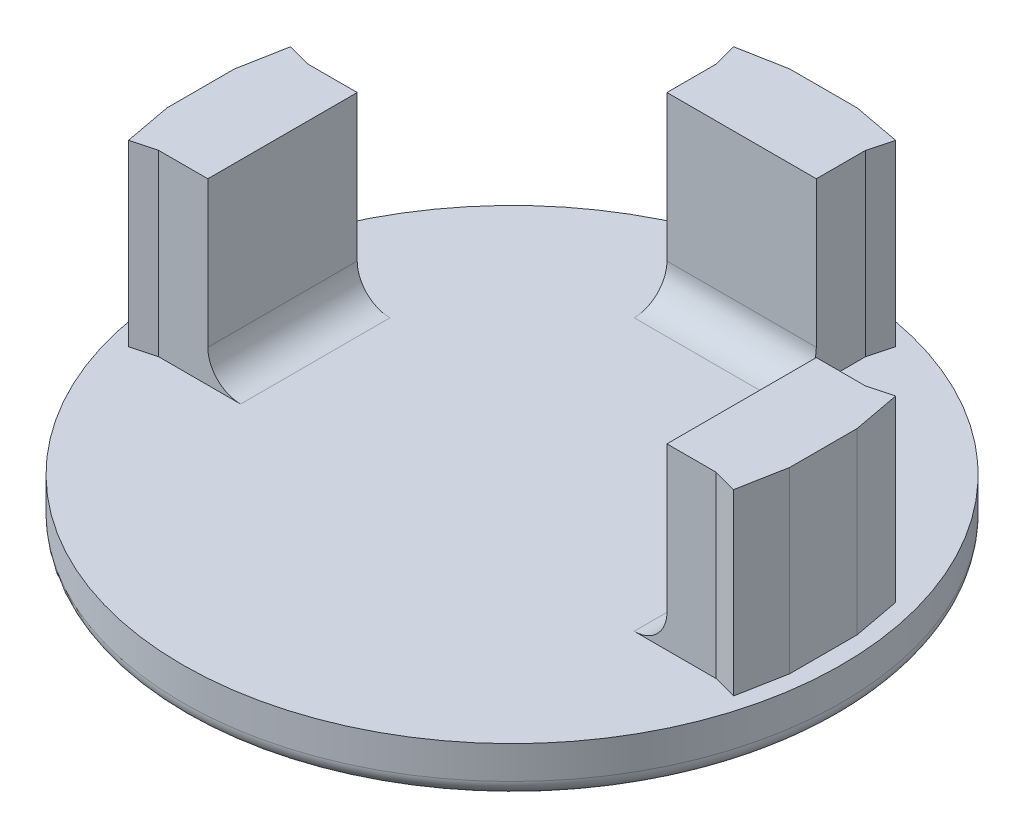
ISO-10303-21;
HEADER;
FILE_DESCRIPTION(('STEP AP214'),'2;1');
FILE_NAME('part.step','',(''),(''),'','','');
FILE_SCHEMA(('AUTOMOTIVE_DESIGN { 1 0 10303 214 1 1 1 1 }'));
ENDSEC;
DATA;
#1=APPLICATION_CONTEXT('core data for automotive mechanical design processes');
#2=APPLICATION_PROTOCOL_DEFINITION('international standard','automotive_design',2000,#1);
#3=PRODUCT_CONTEXT('',#1,'mechanical');
#4=PRODUCT('Part','Part','',(#3));
#5=PRODUCT_RELATED_PRODUCT_CATEGORY('part','',(#4));
#6=PRODUCT_DEFINITION_FORMATION('','',#4);
#7=PRODUCT_DEFINITION_CONTEXT('part definition',#1,'design');
#8=PRODUCT_DEFINITION('design','',#6,#7);
#9=PRODUCT_DEFINITION_SHAPE('','',#8);
#10=(LENGTH_UNIT() NAMED_UNIT(*) SI_UNIT(.MILLI.,.METRE.));
#11=(NAMED_UNIT(*) PLANE_ANGLE_UNIT() SI_UNIT($,.RADIAN.));
#12=(NAMED_UNIT(*) SI_UNIT($,.STERADIAN.) SOLID_ANGLE_UNIT());
#13=UNCERTAINTY_MEASURE_WITH_UNIT(LENGTH_MEASURE(1.E-05),#10,'distance_accuracy_value','');
#14=(GEOMETRIC_REPRESENTATION_CONTEXT(3) GLOBAL_UNCERTAINTY_ASSIGNED_CONTEXT((#13)) GLOBAL_UNIT_ASSIGNED_CONTEXT((#10,
#11,#12)) REPRESENTATION_CONTEXT('',''));
#15=CARTESIAN_POINT('',(0.,0.,0.));
#16=DIRECTION('',(0.,0.,1.));
#17=DIRECTION('',(1.,0.,0.));
#18=AXIS2_PLACEMENT_3D('',#15,#16,#17);
#19=CARTESIAN_POINT('',(0.,3.,0.));
#20=DIRECTION('',(0.,1.,0.));
#21=DIRECTION('',(0.,0.,1.));
#22=AXIS2_PLACEMENT_3D('',#19,#20,#21);
#23=PLANE('',#22);
#24=DIRECTION('',(-1.,0.,0.));
#25=VECTOR('',#24,1.);
#26=CARTESIAN_POINT('',(-14.0002945426876,3.,-4.55521519380437));
#27=LINE('',#26,#25);
#28=CARTESIAN_POINT('',(-12.0002945426876,3.,-4.55521519380437));
#29=VERTEX_POINT('',#28);
#30=CARTESIAN_POINT('',(-17.0002945426876,3.,-4.55521519380437));
#31=VERTEX_POINT('',#30);
#32=EDGE_CURVE('E302',#29,#31,#27,.T.);
#33=ORIENTED_EDGE('',*,*,#32,.F.);
#34=DIRECTION('',(0.,0.,-1.));
#35=VECTOR('',#34,1.);
#36=CARTESIAN_POINT('',(-12.0002945426876,3.,0.));
#37=LINE('',#36,#35);
#38=CARTESIAN_POINT('',(-12.0002945426876,3.,4.55521519380438));
#39=VERTEX_POINT('',#38);
#40=EDGE_CURVE('E398',#29,#39,#37,.F.);
#41=ORIENTED_EDGE('',*,*,#40,.T.);
#42=DIRECTION('',(1.,0.,0.));
#43=VECTOR('',#42,1.);
#44=CARTESIAN_POINT('',(-17.0002945426876,3.,4.55521519380438));
#45=LINE('',#44,#43);
#46=CARTESIAN_POINT('',(-17.0002945426876,3.,4.55521519380438));
#47=VERTEX_POINT('',#46);
#48=EDGE_CURVE('E299',#47,#39,#45,.T.);
#49=ORIENTED_EDGE('',*,*,#48,.F.);
#50=DIRECTION('',(0.965925826289068,0.,-0.258819045102521));
#51=VECTOR('',#50,1.);
#52=CARTESIAN_POINT('',(-18.4491832821212,3.,4.94344376145816));
#53=LINE('',#52,#51);
#54=CARTESIAN_POINT('',(-18.4491832821212,3.,4.94344376145816));
#55=VERTEX_POINT('',#54);
#56=EDGE_CURVE('E296',#55,#47,#53,.T.);
#57=ORIENTED_EDGE('',*,*,#56,.F.);
#58=DIRECTION('',(-0.183736516204825,0.,-0.982975530017362));
#59=VECTOR('',#58,1.);
#60=CARTESIAN_POINT('',(-18.4491832821212,3.,4.94344376145816));
#61=LINE('',#60,#59);
#62=CARTESIAN_POINT('',(-18.9891832821212,3.,2.05448735163028));
#63=VERTEX_POINT('',#62);
#64=EDGE_CURVE('E311',#55,#63,#61,.T.);
#65=ORIENTED_EDGE('',*,*,#64,.T.);
#66=DIRECTION('',(0.,0.,-1.));
#67=VECTOR('',#66,1.);
#68=CARTESIAN_POINT('',(-18.9891832821212,3.,2.05448735163028));
#69=LINE('',#68,#67);
#70=CARTESIAN_POINT('',(-18.9891832821212,3.,-2.05448735163028));
#71=VERTEX_POINT('',#70);
#72=EDGE_CURVE('E309',#63,#71,#69,.T.);
#73=ORIENTED_EDGE('',*,*,#72,.T.);
#74=DIRECTION('',(0.183736516204825,0.,-0.982975530017362));
#75=VECTOR('',#74,1.);
#76=CARTESIAN_POINT('',(-18.9891832821212,3.,-2.05448735163028));
#77=LINE('',#76,#75);
#78=CARTESIAN_POINT('',(-18.4491832821212,3.,-4.94344376145817));
#79=VERTEX_POINT('',#78);
#80=EDGE_CURVE('E307',#71,#79,#77,.T.);
#81=ORIENTED_EDGE('',*,*,#80,.T.);
#82=DIRECTION('',(0.965925826289065,0.,0.258819045102531));
#83=VECTOR('',#82,1.);
#84=CARTESIAN_POINT('',(-18.4491832821212,3.,-4.94344376145817));
#85=LINE('',#84,#83);
#86=EDGE_CURVE('E305',#79,#31,#85,.T.);
#87=ORIENTED_EDGE('',*,*,#86,.T.);
#88=EDGE_LOOP('',(#33,#41,#49,#57,#65,#73,#81,#87));
#89=FACE_BOUND('',#88,.T.);
#90=CARTESIAN_POINT('',(0.,3.,0.));
#91=DIRECTION('',(0.,1.,0.));
#92=DIRECTION('',(0.,0.,1.));
#93=AXIS2_PLACEMENT_3D('',#90,#91,#92);
#94=CIRCLE('',#93,20.1);
#95=CARTESIAN_POINT('',(0.,3.,20.1));
#96=VERTEX_POINT('',#95);
#97=EDGE_CURVE('E392',#96,#96,#94,.T.);
#98=ORIENTED_EDGE('',*,*,#97,.T.);
#99=EDGE_LOOP('',(#98));
#100=FACE_BOUND('',#99,.T.);
#101=DIRECTION('',(0.,0.,-1.));
#102=VECTOR('',#101,1.);
#103=CARTESIAN_POINT('',(4.55521519380437,3.,-14.0002945426876));
#104=LINE('',#103,#102);
#105=CARTESIAN_POINT('',(4.55521519380437,3.,-12.0002945426876));
#106=VERTEX_POINT('',#105);
#107=CARTESIAN_POINT('',(4.55521519380437,3.,-17.0002945426876));
#108=VERTEX_POINT('',#107);
#109=EDGE_CURVE('E359',#106,#108,#104,.T.);
#110=ORIENTED_EDGE('',*,*,#109,.F.);
#111=DIRECTION('',(1.,0.,0.));
#112=VECTOR('',#111,1.);
#113=CARTESIAN_POINT('',(0.,3.,-12.0002945426876));
#114=LINE('',#113,#112);
#115=CARTESIAN_POINT('',(-4.55521519380438,3.,-12.0002945426876));
#116=VERTEX_POINT('',#115);
#117=EDGE_CURVE('E401',#106,#116,#114,.F.);
#118=ORIENTED_EDGE('',*,*,#117,.T.);
#119=DIRECTION('',(0.,0.,1.));
#120=VECTOR('',#119,1.);
#121=CARTESIAN_POINT('',(-4.55521519380438,3.,-17.0002945426876));
#122=LINE('',#121,#120);
#123=CARTESIAN_POINT('',(-4.55521519380438,3.,-17.0002945426876));
#124=VERTEX_POINT('',#123);
#125=EDGE_CURVE('E357',#124,#116,#122,.T.);
#126=ORIENTED_EDGE('',*,*,#125,.F.);
#127=DIRECTION('',(0.258819045102521,0.,0.965925826289068));
#128=VECTOR('',#127,1.);
#129=CARTESIAN_POINT('',(-4.94344376145816,3.,-18.4491832821212));
#130=LINE('',#129,#128);
#131=CARTESIAN_POINT('',(-4.94344376145816,3.,-18.4491832821212));
#132=VERTEX_POINT('',#131);
#133=EDGE_CURVE('E313',#132,#124,#130,.T.);
#134=ORIENTED_EDGE('',*,*,#133,.F.);
#135=DIRECTION('',(0.982975530017362,0.,-0.183736516204825));
#136=VECTOR('',#135,1.);
#137=CARTESIAN_POINT('',(-4.94344376145816,3.,-18.4491832821212));
#138=LINE('',#137,#136);
#139=CARTESIAN_POINT('',(-2.05448735163027,3.,-18.9891832821212));
#140=VERTEX_POINT('',#139);
#141=EDGE_CURVE('E336',#132,#140,#138,.T.);
#142=ORIENTED_EDGE('',*,*,#141,.T.);
#143=DIRECTION('',(1.,0.,0.));
#144=VECTOR('',#143,1.);
#145=CARTESIAN_POINT('',(-2.05448735163027,3.,-18.9891832821212));
#146=LINE('',#145,#144);
#147=CARTESIAN_POINT('',(2.05448735163027,3.,-18.9891832821212));
#148=VERTEX_POINT('',#147);
#149=EDGE_CURVE('E366',#140,#148,#146,.T.);
#150=ORIENTED_EDGE('',*,*,#149,.T.);
#151=DIRECTION('',(0.982975530017362,0.,0.183736516204824));
#152=VECTOR('',#151,1.);
#153=CARTESIAN_POINT('',(2.05448735163027,3.,-18.9891832821212));
#154=LINE('',#153,#152);
#155=CARTESIAN_POINT('',(4.94344376145815,3.,-18.4491832821212));
#156=VERTEX_POINT('',#155);
#157=EDGE_CURVE('E364',#148,#156,#154,.T.);
#158=ORIENTED_EDGE('',*,*,#157,.T.);
#159=DIRECTION('',(-0.258819045102521,0.,0.965925826289068));
#160=VECTOR('',#159,1.);
#161=CARTESIAN_POINT('',(4.94344376145815,3.,-18.4491832821212));
#162=LINE('',#161,#160);
#163=EDGE_CURVE('E362',#156,#108,#162,.T.);
#164=ORIENTED_EDGE('',*,*,#163,.T.);
#165=EDGE_LOOP('',(#110,#118,#126,#134,#142,#150,#158,#164));
#166=FACE_BOUND('',#165,.T.);
#167=DIRECTION('',(1.,0.,0.));
#168=VECTOR('',#167,1.);
#169=CARTESIAN_POINT('',(14.0002945426876,3.,4.55521519380437));
#170=LINE('',#169,#168);
#171=CARTESIAN_POINT('',(12.0002945426876,3.,4.55521519380437));
#172=VERTEX_POINT('',#171);
#173=CARTESIAN_POINT('',(17.0002945426876,3.,4.55521519380437));
#174=VERTEX_POINT('',#173);
#175=EDGE_CURVE('E250',#172,#174,#170,.T.);
#176=ORIENTED_EDGE('',*,*,#175,.F.);
#177=DIRECTION('',(0.,0.,1.));
#178=VECTOR('',#177,1.);
#179=CARTESIAN_POINT('',(12.0002945426876,3.,0.));
#180=LINE('',#179,#178);
#181=CARTESIAN_POINT('',(12.0002945426876,3.,-4.55521519380438));
#182=VERTEX_POINT('',#181);
#183=EDGE_CURVE('E404',#172,#182,#180,.F.);
#184=ORIENTED_EDGE('',*,*,#183,.T.);
#185=DIRECTION('',(-1.,0.,0.));
#186=VECTOR('',#185,1.);
#187=CARTESIAN_POINT('',(17.0002945426876,3.,-4.55521519380438));
#188=LINE('',#187,#186);
#189=CARTESIAN_POINT('',(17.0002945426876,3.,-4.55521519380438));
#190=VERTEX_POINT('',#189);
#191=EDGE_CURVE('E237',#190,#182,#188,.T.);
#192=ORIENTED_EDGE('',*,*,#191,.F.);
#193=DIRECTION('',(-0.965925826289068,0.,0.258819045102521));
#194=VECTOR('',#193,1.);
#195=CARTESIAN_POINT('',(18.4491832821212,3.,-4.94344376145816));
#196=LINE('',#195,#194);
#197=CARTESIAN_POINT('',(18.4491832821212,3.,-4.94344376145816));
#198=VERTEX_POINT('',#197);
#199=EDGE_CURVE('E219',#198,#190,#196,.T.);
#200=ORIENTED_EDGE('',*,*,#199,.F.);
#201=DIRECTION('',(0.183736516204825,0.,0.982975530017362));
#202=VECTOR('',#201,1.);
#203=CARTESIAN_POINT('',(18.4491832821212,3.,-4.94344376145816));
#204=LINE('',#203,#202);
#205=CARTESIAN_POINT('',(18.9891832821212,3.,-2.05448735163028));
#206=VERTEX_POINT('',#205);
#207=EDGE_CURVE('E229',#198,#206,#204,.T.);
#208=ORIENTED_EDGE('',*,*,#207,.T.);
#209=DIRECTION('',(0.,0.,1.));
#210=VECTOR('',#209,1.);
#211=CARTESIAN_POINT('',(18.9891832821212,3.,-2.05448735163028));
#212=LINE('',#211,#210);
#213=CARTESIAN_POINT('',(18.9891832821212,3.,2.05448735163028));
#214=VERTEX_POINT('',#213);
#215=EDGE_CURVE('E234',#206,#214,#212,.T.);
#216=ORIENTED_EDGE('',*,*,#215,.T.);
#217=DIRECTION('',(-0.183736516204824,0.,0.982975530017362));
#218=VECTOR('',#217,1.);
#219=CARTESIAN_POINT('',(18.9891832821212,3.,2.05448735163028));
#220=LINE('',#219,#218);
#221=CARTESIAN_POINT('',(18.4491832821212,3.,4.94344376145816));
#222=VERTEX_POINT('',#221);
#223=EDGE_CURVE('E244',#214,#222,#220,.T.);
#224=ORIENTED_EDGE('',*,*,#223,.T.);
#225=DIRECTION('',(-0.965925826289067,0.,-0.258819045102525));
#226=VECTOR('',#225,1.);
#227=CARTESIAN_POINT('',(18.4491832821212,3.,4.94344376145816));
#228=LINE('',#227,#226);
#229=EDGE_CURVE('E247',#222,#174,#228,.T.);
#230=ORIENTED_EDGE('',*,*,#229,.T.);
#231=EDGE_LOOP('',(#176,#184,#192,#200,#208,#216,#224,#230));
#232=FACE_BOUND('',#231,.T.);
#233=ADVANCED_FACE('F32',(#89,#100,#166,#232),#23,.T.);
#234=CARTESIAN_POINT('',(0.,3.,0.));
#235=DIRECTION('',(0.,-1.,0.));
#236=DIRECTION('',(0.,0.,-1.));
#237=AXIS2_PLACEMENT_3D('',#234,#235,#236);
#238=CYLINDRICAL_SURFACE('',#237,20.1);
#239=CARTESIAN_POINT('',(0.,1.,0.));
#240=DIRECTION('',(0.,1.,0.));
#241=DIRECTION('',(0.,0.,1.));
#242=AXIS2_PLACEMENT_3D('',#239,#240,#241);
#243=CIRCLE('',#242,20.1);
#244=CARTESIAN_POINT('',(0.,1.,20.1));
#245=VERTEX_POINT('',#244);
#246=EDGE_CURVE('E40',#245,#245,#243,.T.);
#247=ORIENTED_EDGE('',*,*,#246,.T.);
#248=EDGE_LOOP('',(#247));
#249=FACE_BOUND('',#248,.T.);
#250=ORIENTED_EDGE('',*,*,#97,.F.);
#251=EDGE_LOOP('',(#250));
#252=FACE_BOUND('',#251,.T.);
#253=ADVANCED_FACE('F425',(#249,#252),#238,.T.);
#254=CARTESIAN_POINT('',(0.,0.,0.));
#255=DIRECTION('',(0.,1.,0.));
#256=DIRECTION('',(0.,0.,1.));
#257=AXIS2_PLACEMENT_3D('',#254,#255,#256);
#258=PLANE('',#257);
#259=CARTESIAN_POINT('',(0.,0.,0.));
#260=DIRECTION('',(0.,1.,0.));
#261=DIRECTION('',(0.,0.,1.));
#262=AXIS2_PLACEMENT_3D('',#259,#260,#261);
#263=CIRCLE('',#262,19.1);
#264=CARTESIAN_POINT('',(0.,0.,19.1));
#265=VERTEX_POINT('',#264);
#266=EDGE_CURVE('E11',#265,#265,#263,.F.);
#267=ORIENTED_EDGE('',*,*,#266,.T.);
#268=EDGE_LOOP('',(#267));
#269=FACE_BOUND('',#268,.T.);
#270=ADVANCED_FACE('F442',(#269),#258,.F.);
#271=CARTESIAN_POINT('',(-4.94344376145816,13.9,-18.4491832821212));
#272=DIRECTION('',(0.965925826289068,0.,-0.258819045102521));
#273=DIRECTION('',(-0.258819045102521,0.,-0.965925826289068));
#274=AXIS2_PLACEMENT_3D('',#271,#272,#273);
#275=PLANE('',#274);
#276=ORIENTED_EDGE('',*,*,#133,.T.);
#277=DIRECTION('',(0.,-1.,0.));
#278=VECTOR('',#277,1.);
#279=CARTESIAN_POINT('',(-4.55521519380438,13.9,-17.0002945426876));
#280=LINE('',#279,#278);
#281=CARTESIAN_POINT('',(-4.55521519380438,13.9,-17.0002945426876));
#282=VERTEX_POINT('',#281);
#283=EDGE_CURVE('E389',#282,#124,#280,.T.);
#284=ORIENTED_EDGE('',*,*,#283,.F.);
#285=DIRECTION('',(0.258819045102521,0.,0.965925826289068));
#286=VECTOR('',#285,1.);
#287=CARTESIAN_POINT('',(-4.94344376145816,13.9,-18.4491832821212));
#288=LINE('',#287,#286);
#289=CARTESIAN_POINT('',(-4.94344376145816,13.9,-18.4491832821212));
#290=VERTEX_POINT('',#289);
#291=EDGE_CURVE('E332',#290,#282,#288,.T.);
#292=ORIENTED_EDGE('',*,*,#291,.F.);
#293=DIRECTION('',(0.,-1.,0.));
#294=VECTOR('',#293,1.);
#295=CARTESIAN_POINT('',(-4.94344376145816,13.9,-18.4491832821212));
#296=LINE('',#295,#294);
#297=EDGE_CURVE('E354',#290,#132,#296,.T.);
#298=ORIENTED_EDGE('',*,*,#297,.T.);
#299=EDGE_LOOP('',(#276,#284,#292,#298));
#300=FACE_BOUND('',#299,.T.);
#301=ADVANCED_FACE('F447',(#300),#275,.F.);
#302=CARTESIAN_POINT('',(-4.55521519380438,13.9,-17.0002945426876));
#303=DIRECTION('',(1.,0.,0.));
#304=DIRECTION('',(0.,0.,-1.));
#305=AXIS2_PLACEMENT_3D('',#302,#303,#304);
#306=PLANE('',#305);
#307=ORIENTED_EDGE('',*,*,#125,.T.);
#308=CARTESIAN_POINT('',(-4.55521519380438,5.,-12.0002945426876));
#309=DIRECTION('',(1.,0.,0.));
#310=DIRECTION('',(0.,0.,-1.));
#311=AXIS2_PLACEMENT_3D('',#308,#309,#310);
#312=CIRCLE('',#311,2.);
#313=CARTESIAN_POINT('',(-4.55521519380438,5.,-14.0002945426876));
#314=VERTEX_POINT('',#313);
#315=EDGE_CURVE('E419',#116,#314,#312,.T.);
#316=ORIENTED_EDGE('',*,*,#315,.T.);
#317=DIRECTION('',(0.,-1.,0.));
#318=VECTOR('',#317,1.);
#319=CARTESIAN_POINT('',(-4.55521519380438,13.9,-14.0002945426876));
#320=LINE('',#319,#318);
#321=CARTESIAN_POINT('',(-4.55521519380438,13.9,-14.0002945426876));
#322=VERTEX_POINT('',#321);
#323=EDGE_CURVE('E386',#322,#314,#320,.T.);
#324=ORIENTED_EDGE('',*,*,#323,.F.);
#325=DIRECTION('',(0.,0.,1.));
#326=VECTOR('',#325,1.);
#327=CARTESIAN_POINT('',(-4.55521519380438,13.9,-17.0002945426876));
#328=LINE('',#327,#326);
#329=EDGE_CURVE('E335',#282,#322,#328,.T.);
#330=ORIENTED_EDGE('',*,*,#329,.F.);
#331=ORIENTED_EDGE('',*,*,#283,.T.);
#332=EDGE_LOOP('',(#307,#316,#324,#330,#331));
#333=FACE_BOUND('',#332,.T.);
#334=ADVANCED_FACE('F466',(#333),#306,.F.);
#335=CARTESIAN_POINT('',(-4.55521519380438,13.9,-14.0002945426876));
#336=DIRECTION('',(0.,0.,-1.));
#337=DIRECTION('',(-1.,0.,0.));
#338=AXIS2_PLACEMENT_3D('',#335,#336,#337);
#339=PLANE('',#338);
#340=ORIENTED_EDGE('',*,*,#323,.T.);
#341=DIRECTION('',(1.,0.,0.));
#342=VECTOR('',#341,1.);
#343=CARTESIAN_POINT('',(-4.55521519380438,5.,-14.0002945426876));
#344=LINE('',#343,#342);
#345=CARTESIAN_POINT('',(4.55521519380437,5.,-14.0002945426876));
#346=VERTEX_POINT('',#345);
#347=EDGE_CURVE('E406',#314,#346,#344,.T.);
#348=ORIENTED_EDGE('',*,*,#347,.T.);
#349=DIRECTION('',(0.,-1.,0.));
#350=VECTOR('',#349,1.);
#351=CARTESIAN_POINT('',(4.55521519380437,13.9,-14.0002945426876));
#352=LINE('',#351,#350);
#353=CARTESIAN_POINT('',(4.55521519380437,13.9,-14.0002945426876));
#354=VERTEX_POINT('',#353);
#355=EDGE_CURVE('E383',#354,#346,#352,.T.);
#356=ORIENTED_EDGE('',*,*,#355,.F.);
#357=DIRECTION('',(1.,0.,0.));
#358=VECTOR('',#357,1.);
#359=CARTESIAN_POINT('',(-4.55521519380438,13.9,-14.0002945426876));
#360=LINE('',#359,#358);
#361=EDGE_CURVE('E338',#322,#354,#360,.T.);
#362=ORIENTED_EDGE('',*,*,#361,.F.);
#363=EDGE_LOOP('',(#340,#348,#356,#362));
#364=FACE_BOUND('',#363,.T.);
#365=ADVANCED_FACE('F469',(#364),#339,.F.);
#366=CARTESIAN_POINT('',(4.55521519380437,13.9,-14.0002945426876));
#367=DIRECTION('',(-1.,0.,0.));
#368=DIRECTION('',(0.,0.,1.));
#369=AXIS2_PLACEMENT_3D('',#366,#367,#368);
#370=PLANE('',#369);
#371=ORIENTED_EDGE('',*,*,#109,.T.);
#372=DIRECTION('',(0.,-1.,0.));
#373=VECTOR('',#372,1.);
#374=CARTESIAN_POINT('',(4.55521519380437,13.9,-17.0002945426876));
#375=LINE('',#374,#373);
#376=CARTESIAN_POINT('',(4.55521519380437,13.9,-17.0002945426876));
#377=VERTEX_POINT('',#376);
#378=EDGE_CURVE('E380',#377,#108,#375,.T.);
#379=ORIENTED_EDGE('',*,*,#378,.F.);
#380=DIRECTION('',(0.,0.,-1.));
#381=VECTOR('',#380,1.);
#382=CARTESIAN_POINT('',(4.55521519380437,13.9,-14.0002945426876));
#383=LINE('',#382,#381);
#384=EDGE_CURVE('E340',#354,#377,#383,.T.);
#385=ORIENTED_EDGE('',*,*,#384,.F.);
#386=ORIENTED_EDGE('',*,*,#355,.T.);
#387=CARTESIAN_POINT('',(4.55521519380437,5.,-12.0002945426876));
#388=DIRECTION('',(-1.,0.,0.));
#389=DIRECTION('',(0.,0.,1.));
#390=AXIS2_PLACEMENT_3D('',#387,#388,#389);
#391=CIRCLE('',#390,2.);
#392=EDGE_CURVE('E416',#346,#106,#391,.T.);
#393=ORIENTED_EDGE('',*,*,#392,.T.);
#394=EDGE_LOOP('',(#371,#379,#385,#386,#393));
#395=FACE_BOUND('',#394,.T.);
#396=ADVANCED_FACE('F484',(#395),#370,.F.);
#397=CARTESIAN_POINT('',(4.94344376145815,13.9,-18.4491832821212));
#398=DIRECTION('',(0.965925826289068,0.,0.258819045102521));
#399=DIRECTION('',(0.258819045102521,0.,-0.965925826289068));
#400=AXIS2_PLACEMENT_3D('',#397,#398,#399);
#401=PLANE('',#400);
#402=ORIENTED_EDGE('',*,*,#163,.F.);
#403=DIRECTION('',(0.,-1.,0.));
#404=VECTOR('',#403,1.);
#405=CARTESIAN_POINT('',(4.94344376145815,13.9,-18.4491832821212));
#406=LINE('',#405,#404);
#407=CARTESIAN_POINT('',(4.94344376145815,13.9,-18.4491832821212));
#408=VERTEX_POINT('',#407);
#409=EDGE_CURVE('E377',#408,#156,#406,.T.);
#410=ORIENTED_EDGE('',*,*,#409,.F.);
#411=DIRECTION('',(-0.258819045102521,0.,0.965925826289068));
#412=VECTOR('',#411,1.);
#413=CARTESIAN_POINT('',(4.94344376145815,13.9,-18.4491832821212));
#414=LINE('',#413,#412);
#415=EDGE_CURVE('E342',#408,#377,#414,.T.);
#416=ORIENTED_EDGE('',*,*,#415,.T.);
#417=ORIENTED_EDGE('',*,*,#378,.T.);
#418=EDGE_LOOP('',(#402,#410,#416,#417));
#419=FACE_BOUND('',#418,.T.);
#420=ADVANCED_FACE('F486',(#419),#401,.T.);
#421=CARTESIAN_POINT('',(2.05448735163027,13.9,-18.9891832821212));
#422=DIRECTION('',(0.183736516204824,0.,-0.982975530017362));
#423=DIRECTION('',(-0.982975530017362,0.,-0.183736516204824));
#424=AXIS2_PLACEMENT_3D('',#421,#422,#423);
#425=PLANE('',#424);
#426=ORIENTED_EDGE('',*,*,#157,.F.);
#427=DIRECTION('',(0.,-1.,0.));
#428=VECTOR('',#427,1.);
#429=CARTESIAN_POINT('',(2.05448735163027,13.9,-18.9891832821212));
#430=LINE('',#429,#428);
#431=CARTESIAN_POINT('',(2.05448735163027,13.9,-18.9891832821212));
#432=VERTEX_POINT('',#431);
#433=EDGE_CURVE('E374',#432,#148,#430,.T.);
#434=ORIENTED_EDGE('',*,*,#433,.F.);
#435=DIRECTION('',(0.982975530017362,0.,0.183736516204824));
#436=VECTOR('',#435,1.);
#437=CARTESIAN_POINT('',(2.05448735163027,13.9,-18.9891832821212));
#438=LINE('',#437,#436);
#439=EDGE_CURVE('E345',#432,#408,#438,.T.);
#440=ORIENTED_EDGE('',*,*,#439,.T.);
#441=ORIENTED_EDGE('',*,*,#409,.T.);
#442=EDGE_LOOP('',(#426,#434,#440,#441));
#443=FACE_BOUND('',#442,.T.);
#444=ADVANCED_FACE('F491',(#443),#425,.T.);
#445=CARTESIAN_POINT('',(-2.05448735163027,13.9,-18.9891832821212));
#446=DIRECTION('',(0.,0.,-1.));
#447=DIRECTION('',(-1.,0.,0.));
#448=AXIS2_PLACEMENT_3D('',#445,#446,#447);
#449=PLANE('',#448);
#450=ORIENTED_EDGE('',*,*,#149,.F.);
#451=DIRECTION('',(0.,-1.,0.));
#452=VECTOR('',#451,1.);
#453=CARTESIAN_POINT('',(-2.05448735163027,13.9,-18.9891832821212));
#454=LINE('',#453,#452);
#455=CARTESIAN_POINT('',(-2.05448735163027,13.9,-18.9891832821212));
#456=VERTEX_POINT('',#455);
#457=EDGE_CURVE('E371',#456,#140,#454,.T.);
#458=ORIENTED_EDGE('',*,*,#457,.F.);
#459=DIRECTION('',(1.,0.,0.));
#460=VECTOR('',#459,1.);
#461=CARTESIAN_POINT('',(-2.05448735163027,13.9,-18.9891832821212));
#462=LINE('',#461,#460);
#463=EDGE_CURVE('E348',#456,#432,#462,.T.);
#464=ORIENTED_EDGE('',*,*,#463,.T.);
#465=ORIENTED_EDGE('',*,*,#433,.T.);
#466=EDGE_LOOP('',(#450,#458,#464,#465));
#467=FACE_BOUND('',#466,.T.);
#468=ADVANCED_FACE('F494',(#467),#449,.T.);
#469=CARTESIAN_POINT('',(-4.94344376145816,13.9,-18.4491832821212));
#470=DIRECTION('',(-0.183736516204825,0.,-0.982975530017362));
#471=DIRECTION('',(-0.982975530017362,0.,0.183736516204825));
#472=AXIS2_PLACEMENT_3D('',#469,#470,#471);
#473=PLANE('',#472);
#474=ORIENTED_EDGE('',*,*,#141,.F.);
#475=ORIENTED_EDGE('',*,*,#297,.F.);
#476=DIRECTION('',(0.982975530017362,0.,-0.183736516204825));
#477=VECTOR('',#476,1.);
#478=CARTESIAN_POINT('',(-4.94344376145816,13.9,-18.4491832821212));
#479=LINE('',#478,#477);
#480=EDGE_CURVE('E351',#290,#456,#479,.T.);
#481=ORIENTED_EDGE('',*,*,#480,.T.);
#482=ORIENTED_EDGE('',*,*,#457,.T.);
#483=EDGE_LOOP('',(#474,#475,#481,#482));
#484=FACE_BOUND('',#483,.T.);
#485=ADVANCED_FACE('F496',(#484),#473,.T.);
#486=CARTESIAN_POINT('',(0.,13.9,0.));
#487=DIRECTION('',(0.,1.,0.));
#488=DIRECTION('',(0.,0.,1.));
#489=AXIS2_PLACEMENT_3D('',#486,#487,#488);
#490=PLANE('',#489);
#491=ORIENTED_EDGE('',*,*,#291,.T.);
#492=ORIENTED_EDGE('',*,*,#329,.T.);
#493=ORIENTED_EDGE('',*,*,#361,.T.);
#494=ORIENTED_EDGE('',*,*,#384,.T.);
#495=ORIENTED_EDGE('',*,*,#415,.F.);
#496=ORIENTED_EDGE('',*,*,#439,.F.);
#497=ORIENTED_EDGE('',*,*,#463,.F.);
#498=ORIENTED_EDGE('',*,*,#480,.F.);
#499=EDGE_LOOP('',(#491,#492,#493,#494,#495,#496,#497,#498));
#500=FACE_BOUND('',#499,.T.);
#501=ADVANCED_FACE('F473',(#500),#490,.T.);
#502=CARTESIAN_POINT('',(-18.4491832821212,13.9,4.94344376145816));
#503=DIRECTION('',(-0.982975530017362,0.,0.183736516204825));
#504=DIRECTION('',(0.183736516204825,0.,0.982975530017362));
#505=AXIS2_PLACEMENT_3D('',#502,#503,#504);
#506=PLANE('',#505);
#507=ORIENTED_EDGE('',*,*,#64,.F.);
#508=DIRECTION('',(0.,-1.,0.));
#509=VECTOR('',#508,1.);
#510=CARTESIAN_POINT('',(-18.4491832821212,13.9,4.94344376145816));
#511=LINE('',#510,#509);
#512=CARTESIAN_POINT('',(-18.4491832821212,13.9,4.94344376145816));
#513=VERTEX_POINT('',#512);
#514=EDGE_CURVE('E253',#513,#55,#511,.T.);
#515=ORIENTED_EDGE('',*,*,#514,.F.);
#516=DIRECTION('',(-0.183736516204825,0.,-0.982975530017362));
#517=VECTOR('',#516,1.);
#518=CARTESIAN_POINT('',(-18.4491832821212,13.9,4.94344376145816));
#519=LINE('',#518,#517);
#520=CARTESIAN_POINT('',(-18.9891832821212,13.9,2.05448735163028));
#521=VERTEX_POINT('',#520);
#522=EDGE_CURVE('E300',#513,#521,#519,.T.);
#523=ORIENTED_EDGE('',*,*,#522,.T.);
#524=DIRECTION('',(0.,-1.,0.));
#525=VECTOR('',#524,1.);
#526=CARTESIAN_POINT('',(-18.9891832821212,13.9,2.05448735163028));
#527=LINE('',#526,#525);
#528=EDGE_CURVE('E273',#521,#63,#527,.T.);
#529=ORIENTED_EDGE('',*,*,#528,.T.);
#530=EDGE_LOOP('',(#507,#515,#523,#529));
#531=FACE_BOUND('',#530,.T.);
#532=ADVANCED_FACE('F503',(#531),#506,.T.);
#533=CARTESIAN_POINT('',(-18.4491832821212,13.9,4.94344376145816));
#534=DIRECTION('',(-0.258819045102521,0.,-0.965925826289068));
#535=DIRECTION('',(-0.965925826289068,0.,0.258819045102521));
#536=AXIS2_PLACEMENT_3D('',#533,#534,#535);
#537=PLANE('',#536);
#538=ORIENTED_EDGE('',*,*,#56,.T.);
#539=DIRECTION('',(0.,-1.,0.));
#540=VECTOR('',#539,1.);
#541=CARTESIAN_POINT('',(-17.0002945426876,13.9,4.55521519380438));
#542=LINE('',#541,#540);
#543=CARTESIAN_POINT('',(-17.0002945426876,13.9,4.55521519380438));
#544=VERTEX_POINT('',#543);
#545=EDGE_CURVE('E291',#544,#47,#542,.T.);
#546=ORIENTED_EDGE('',*,*,#545,.F.);
#547=DIRECTION('',(0.965925826289068,0.,-0.258819045102521));
#548=VECTOR('',#547,1.);
#549=CARTESIAN_POINT('',(-18.4491832821212,13.9,4.94344376145816));
#550=LINE('',#549,#548);
#551=EDGE_CURVE('E276',#513,#544,#550,.T.);
#552=ORIENTED_EDGE('',*,*,#551,.F.);
#553=ORIENTED_EDGE('',*,*,#514,.T.);
#554=EDGE_LOOP('',(#538,#546,#552,#553));
#555=FACE_BOUND('',#554,.T.);
#556=ADVANCED_FACE('F620',(#555),#537,.F.);
#557=CARTESIAN_POINT('',(-17.0002945426876,13.9,4.55521519380438));
#558=DIRECTION('',(0.,0.,-1.));
#559=DIRECTION('',(-1.,0.,0.));
#560=AXIS2_PLACEMENT_3D('',#557,#558,#559);
#561=PLANE('',#560);
#562=ORIENTED_EDGE('',*,*,#48,.T.);
#563=CARTESIAN_POINT('',(-12.0002945426876,5.,4.55521519380438));
#564=DIRECTION('',(0.,0.,-1.));
#565=DIRECTION('',(-1.,0.,0.));
#566=AXIS2_PLACEMENT_3D('',#563,#564,#565);
#567=CIRCLE('',#566,2.);
#568=CARTESIAN_POINT('',(-14.0002945426876,5.,4.55521519380438));
#569=VERTEX_POINT('',#568);
#570=EDGE_CURVE('E47',#39,#569,#567,.T.);
#571=ORIENTED_EDGE('',*,*,#570,.T.);
#572=DIRECTION('',(0.,-1.,0.));
#573=VECTOR('',#572,1.);
#574=CARTESIAN_POINT('',(-14.0002945426876,13.9,4.55521519380438));
#575=LINE('',#574,#573);
#576=CARTESIAN_POINT('',(-14.0002945426876,13.9,4.55521519380438));
#577=VERTEX_POINT('',#576);
#578=EDGE_CURVE('E289',#577,#569,#575,.T.);
#579=ORIENTED_EDGE('',*,*,#578,.F.);
#580=DIRECTION('',(1.,0.,0.));
#581=VECTOR('',#580,1.);
#582=CARTESIAN_POINT('',(-17.0002945426876,13.9,4.55521519380438));
#583=LINE('',#582,#581);
#584=EDGE_CURVE('E315',#544,#577,#583,.T.);
#585=ORIENTED_EDGE('',*,*,#584,.F.);
#586=ORIENTED_EDGE('',*,*,#545,.T.);
#587=EDGE_LOOP('',(#562,#571,#579,#585,#586));
#588=FACE_BOUND('',#587,.T.);
#589=ADVANCED_FACE('F610',(#588),#561,.F.);
#590=CARTESIAN_POINT('',(-14.0002945426876,13.9,4.55521519380438));
#591=DIRECTION('',(-1.,0.,0.));
#592=DIRECTION('',(0.,0.,1.));
#593=AXIS2_PLACEMENT_3D('',#590,#591,#592);
#594=PLANE('',#593);
#595=ORIENTED_EDGE('',*,*,#578,.T.);
#596=DIRECTION('',(0.,0.,-1.));
#597=VECTOR('',#596,1.);
#598=CARTESIAN_POINT('',(-14.0002945426876,5.,4.55521519380438));
#599=LINE('',#598,#597);
#600=CARTESIAN_POINT('',(-14.0002945426876,5.,-4.55521519380437));
#601=VERTEX_POINT('',#600);
#602=EDGE_CURVE('E409',#569,#601,#599,.T.);
#603=ORIENTED_EDGE('',*,*,#602,.T.);
#604=DIRECTION('',(0.,-1.,0.));
#605=VECTOR('',#604,1.);
#606=CARTESIAN_POINT('',(-14.0002945426876,13.9,-4.55521519380437));
#607=LINE('',#606,#605);
#608=CARTESIAN_POINT('',(-14.0002945426876,13.9,-4.55521519380437));
#609=VERTEX_POINT('',#608);
#610=EDGE_CURVE('E286',#609,#601,#607,.T.);
#611=ORIENTED_EDGE('',*,*,#610,.F.);
#612=DIRECTION('',(0.,0.,-1.));
#613=VECTOR('',#612,1.);
#614=CARTESIAN_POINT('',(-14.0002945426876,13.9,4.55521519380438));
#615=LINE('',#614,#613);
#616=EDGE_CURVE('E317',#577,#609,#615,.T.);
#617=ORIENTED_EDGE('',*,*,#616,.F.);
#618=EDGE_LOOP('',(#595,#603,#611,#617));
#619=FACE_BOUND('',#618,.T.);
#620=ADVANCED_FACE('F598',(#619),#594,.F.);
#621=CARTESIAN_POINT('',(-14.0002945426876,13.9,-4.55521519380437));
#622=DIRECTION('',(0.,0.,1.));
#623=DIRECTION('',(1.,0.,0.));
#624=AXIS2_PLACEMENT_3D('',#621,#622,#623);
#625=PLANE('',#624);
#626=ORIENTED_EDGE('',*,*,#32,.T.);
#627=DIRECTION('',(0.,-1.,0.));
#628=VECTOR('',#627,1.);
#629=CARTESIAN_POINT('',(-17.0002945426876,13.9,-4.55521519380437));
#630=LINE('',#629,#628);
#631=CARTESIAN_POINT('',(-17.0002945426876,13.9,-4.55521519380437));
#632=VERTEX_POINT('',#631);
#633=EDGE_CURVE('E283',#632,#31,#630,.T.);
#634=ORIENTED_EDGE('',*,*,#633,.F.);
#635=DIRECTION('',(-1.,0.,0.));
#636=VECTOR('',#635,1.);
#637=CARTESIAN_POINT('',(-14.0002945426876,13.9,-4.55521519380437));
#638=LINE('',#637,#636);
#639=EDGE_CURVE('E319',#609,#632,#638,.T.);
#640=ORIENTED_EDGE('',*,*,#639,.F.);
#641=ORIENTED_EDGE('',*,*,#610,.T.);
#642=CARTESIAN_POINT('',(-12.0002945426876,5.,-4.55521519380437));
#643=DIRECTION('',(0.,0.,1.));
#644=DIRECTION('',(1.,0.,0.));
#645=AXIS2_PLACEMENT_3D('',#642,#643,#644);
#646=CIRCLE('',#645,2.);
#647=EDGE_CURVE('E55',#601,#29,#646,.T.);
#648=ORIENTED_EDGE('',*,*,#647,.T.);
#649=EDGE_LOOP('',(#626,#634,#640,#641,#648));
#650=FACE_BOUND('',#649,.T.);
#651=ADVANCED_FACE('F592',(#650),#625,.F.);
#652=CARTESIAN_POINT('',(-18.4491832821212,13.9,-4.94344376145817));
#653=DIRECTION('',(0.258819045102531,0.,-0.965925826289066));
#654=DIRECTION('',(-0.965925826289066,0.,-0.258819045102531));
#655=AXIS2_PLACEMENT_3D('',#652,#653,#654);
#656=PLANE('',#655);
#657=ORIENTED_EDGE('',*,*,#86,.F.);
#658=DIRECTION('',(0.,-1.,0.));
#659=VECTOR('',#658,1.);
#660=CARTESIAN_POINT('',(-18.4491832821212,13.9,-4.94344376145817));
#661=LINE('',#660,#659);
#662=CARTESIAN_POINT('',(-18.4491832821212,13.9,-4.94344376145817));
#663=VERTEX_POINT('',#662);
#664=EDGE_CURVE('E280',#663,#79,#661,.T.);
#665=ORIENTED_EDGE('',*,*,#664,.F.);
#666=DIRECTION('',(0.965925826289065,0.,0.258819045102531));
#667=VECTOR('',#666,1.);
#668=CARTESIAN_POINT('',(-18.4491832821212,13.9,-4.94344376145817));
#669=LINE('',#668,#667);
#670=EDGE_CURVE('E321',#663,#632,#669,.T.);
#671=ORIENTED_EDGE('',*,*,#670,.T.);
#672=ORIENTED_EDGE('',*,*,#633,.T.);
#673=EDGE_LOOP('',(#657,#665,#671,#672));
#674=FACE_BOUND('',#673,.T.);
#675=ADVANCED_FACE('F597',(#674),#656,.T.);
#676=CARTESIAN_POINT('',(-18.9891832821212,13.9,-2.05448735163028));
#677=DIRECTION('',(-0.982975530017362,0.,-0.183736516204825));
#678=DIRECTION('',(-0.183736516204825,0.,0.982975530017362));
#679=AXIS2_PLACEMENT_3D('',#676,#677,#678);
#680=PLANE('',#679);
#681=ORIENTED_EDGE('',*,*,#80,.F.);
#682=DIRECTION('',(0.,-1.,0.));
#683=VECTOR('',#682,1.);
#684=CARTESIAN_POINT('',(-18.9891832821212,13.9,-2.05448735163028));
#685=LINE('',#684,#683);
#686=CARTESIAN_POINT('',(-18.9891832821212,13.9,-2.05448735163028));
#687=VERTEX_POINT('',#686);
#688=EDGE_CURVE('E277',#687,#71,#685,.T.);
#689=ORIENTED_EDGE('',*,*,#688,.F.);
#690=DIRECTION('',(0.183736516204825,0.,-0.982975530017362));
#691=VECTOR('',#690,1.);
#692=CARTESIAN_POINT('',(-18.9891832821212,13.9,-2.05448735163028));
#693=LINE('',#692,#691);
#694=EDGE_CURVE('E324',#687,#663,#693,.T.);
#695=ORIENTED_EDGE('',*,*,#694,.T.);
#696=ORIENTED_EDGE('',*,*,#664,.T.);
#697=EDGE_LOOP('',(#681,#689,#695,#696));
#698=FACE_BOUND('',#697,.T.);
#699=ADVANCED_FACE('F707',(#698),#680,.T.);
#700=CARTESIAN_POINT('',(-18.9891832821212,13.9,2.05448735163028));
#701=DIRECTION('',(-1.,0.,0.));
#702=DIRECTION('',(0.,0.,1.));
#703=AXIS2_PLACEMENT_3D('',#700,#701,#702);
#704=PLANE('',#703);
#705=ORIENTED_EDGE('',*,*,#72,.F.);
#706=ORIENTED_EDGE('',*,*,#528,.F.);
#707=DIRECTION('',(0.,0.,-1.));
#708=VECTOR('',#707,1.);
#709=CARTESIAN_POINT('',(-18.9891832821212,13.9,2.05448735163028));
#710=LINE('',#709,#708);
#711=EDGE_CURVE('E327',#521,#687,#710,.T.);
#712=ORIENTED_EDGE('',*,*,#711,.T.);
#713=ORIENTED_EDGE('',*,*,#688,.T.);
#714=EDGE_LOOP('',(#705,#706,#712,#713));
#715=FACE_BOUND('',#714,.T.);
#716=ADVANCED_FACE('F698',(#715),#704,.T.);
#717=CARTESIAN_POINT('',(0.,13.9,0.));
#718=DIRECTION('',(0.,-1.,0.));
#719=DIRECTION('',(0.,0.,-1.));
#720=AXIS2_PLACEMENT_3D('',#717,#718,#719);
#721=PLANE('',#720);
#722=ORIENTED_EDGE('',*,*,#522,.F.);
#723=ORIENTED_EDGE('',*,*,#551,.T.);
#724=ORIENTED_EDGE('',*,*,#584,.T.);
#725=ORIENTED_EDGE('',*,*,#616,.T.);
#726=ORIENTED_EDGE('',*,*,#639,.T.);
#727=ORIENTED_EDGE('',*,*,#670,.F.);
#728=ORIENTED_EDGE('',*,*,#694,.F.);
#729=ORIENTED_EDGE('',*,*,#711,.F.);
#730=EDGE_LOOP('',(#722,#723,#724,#725,#726,#727,#728,#729));
#731=FACE_BOUND('',#730,.T.);
#732=ADVANCED_FACE('F584',(#731),#721,.F.);
#733=CARTESIAN_POINT('',(14.0002945426876,13.9,-4.55521519380438));
#734=DIRECTION('',(1.,0.,0.));
#735=DIRECTION('',(0.,0.,-1.));
#736=AXIS2_PLACEMENT_3D('',#733,#734,#735);
#737=PLANE('',#736);
#738=DIRECTION('',(0.,-1.,0.));
#739=VECTOR('',#738,1.);
#740=CARTESIAN_POINT('',(14.0002945426876,13.9,-4.55521519380438));
#741=LINE('',#740,#739);
#742=CARTESIAN_POINT('',(14.0002945426876,13.9,-4.55521519380438));
#743=VERTEX_POINT('',#742);
#744=CARTESIAN_POINT('',(14.0002945426876,5.,-4.55521519380438));
#745=VERTEX_POINT('',#744);
#746=EDGE_CURVE('E256',#743,#745,#741,.T.);
#747=ORIENTED_EDGE('',*,*,#746,.T.);
#748=DIRECTION('',(0.,0.,1.));
#749=VECTOR('',#748,1.);
#750=CARTESIAN_POINT('',(14.0002945426876,5.,-4.55521519380438));
#751=LINE('',#750,#749);
#752=CARTESIAN_POINT('',(14.0002945426876,5.,4.55521519380437));
#753=VERTEX_POINT('',#752);
#754=EDGE_CURVE('E395',#745,#753,#751,.T.);
#755=ORIENTED_EDGE('',*,*,#754,.T.);
#756=DIRECTION('',(0.,-1.,0.));
#757=VECTOR('',#756,1.);
#758=CARTESIAN_POINT('',(14.0002945426876,13.9,4.55521519380437));
#759=LINE('',#758,#757);
#760=CARTESIAN_POINT('',(14.0002945426876,13.9,4.55521519380437));
#761=VERTEX_POINT('',#760);
#762=EDGE_CURVE('E795',#761,#753,#759,.T.);
#763=ORIENTED_EDGE('',*,*,#762,.F.);
#764=DIRECTION('',(0.,0.,1.));
#765=VECTOR('',#764,1.);
#766=CARTESIAN_POINT('',(14.0002945426876,13.9,-4.55521519380438));
#767=LINE('',#766,#765);
#768=EDGE_CURVE('E239',#743,#761,#767,.T.);
#769=ORIENTED_EDGE('',*,*,#768,.F.);
#770=EDGE_LOOP('',(#747,#755,#763,#769));
#771=FACE_BOUND('',#770,.T.);
#772=ADVANCED_FACE('F572',(#771),#737,.F.);
#773=CARTESIAN_POINT('',(14.0002945426876,13.9,4.55521519380437));
#774=DIRECTION('',(0.,0.,-1.));
#775=DIRECTION('',(-1.,0.,0.));
#776=AXIS2_PLACEMENT_3D('',#773,#774,#775);
#777=PLANE('',#776);
#778=ORIENTED_EDGE('',*,*,#175,.T.);
#779=DIRECTION('',(0.,-1.,0.));
#780=VECTOR('',#779,1.);
#781=CARTESIAN_POINT('',(17.0002945426876,13.9,4.55521519380437));
#782=LINE('',#781,#780);
#783=CARTESIAN_POINT('',(17.0002945426876,13.9,4.55521519380437));
#784=VERTEX_POINT('',#783);
#785=EDGE_CURVE('E789',#784,#174,#782,.T.);
#786=ORIENTED_EDGE('',*,*,#785,.F.);
#787=DIRECTION('',(1.,0.,0.));
#788=VECTOR('',#787,1.);
#789=CARTESIAN_POINT('',(14.0002945426876,13.9,4.55521519380437));
#790=LINE('',#789,#788);
#791=EDGE_CURVE('E269',#761,#784,#790,.T.);
#792=ORIENTED_EDGE('',*,*,#791,.F.);
#793=ORIENTED_EDGE('',*,*,#762,.T.);
#794=CARTESIAN_POINT('',(12.0002945426876,5.,4.55521519380437));
#795=DIRECTION('',(0.,0.,-1.));
#796=DIRECTION('',(-1.,0.,0.));
#797=AXIS2_PLACEMENT_3D('',#794,#795,#796);
#798=CIRCLE('',#797,2.);
#799=EDGE_CURVE('E411',#753,#172,#798,.T.);
#800=ORIENTED_EDGE('',*,*,#799,.T.);
#801=EDGE_LOOP('',(#778,#786,#792,#793,#800));
#802=FACE_BOUND('',#801,.T.);
#803=ADVANCED_FACE('F566',(#802),#777,.F.);
#804=CARTESIAN_POINT('',(18.4491832821212,13.9,4.94344376145816));
#805=DIRECTION('',(-0.258819045102525,0.,0.965925826289067));
#806=DIRECTION('',(0.965925826289067,0.,0.258819045102525));
#807=AXIS2_PLACEMENT_3D('',#804,#805,#806);
#808=PLANE('',#807);
#809=ORIENTED_EDGE('',*,*,#229,.F.);
#810=DIRECTION('',(0.,-1.,0.));
#811=VECTOR('',#810,1.);
#812=CARTESIAN_POINT('',(18.4491832821212,13.9,4.94344376145816));
#813=LINE('',#812,#811);
#814=CARTESIAN_POINT('',(18.4491832821212,13.9,4.94344376145816));
#815=VERTEX_POINT('',#814);
#816=EDGE_CURVE('E786',#815,#222,#813,.T.);
#817=ORIENTED_EDGE('',*,*,#816,.F.);
#818=DIRECTION('',(-0.965925826289067,0.,-0.258819045102525));
#819=VECTOR('',#818,1.);
#820=CARTESIAN_POINT('',(18.4491832821212,13.9,4.94344376145816));
#821=LINE('',#820,#819);
#822=EDGE_CURVE('E266',#815,#784,#821,.T.);
#823=ORIENTED_EDGE('',*,*,#822,.T.);
#824=ORIENTED_EDGE('',*,*,#785,.T.);
#825=EDGE_LOOP('',(#809,#817,#823,#824));
#826=FACE_BOUND('',#825,.T.);
#827=ADVANCED_FACE('F571',(#826),#808,.T.);
#828=CARTESIAN_POINT('',(18.9891832821212,13.9,2.05448735163028));
#829=DIRECTION('',(0.982975530017362,0.,0.183736516204824));
#830=DIRECTION('',(0.183736516204824,0.,-0.982975530017362));
#831=AXIS2_PLACEMENT_3D('',#828,#829,#830);
#832=PLANE('',#831);
#833=ORIENTED_EDGE('',*,*,#223,.F.);
#834=DIRECTION('',(0.,-1.,0.));
#835=VECTOR('',#834,1.);
#836=CARTESIAN_POINT('',(18.9891832821212,13.9,2.05448735163028));
#837=LINE('',#836,#835);
#838=CARTESIAN_POINT('',(18.9891832821212,13.9,2.05448735163028));
#839=VERTEX_POINT('',#838);
#840=EDGE_CURVE('E791',#839,#214,#837,.T.);
#841=ORIENTED_EDGE('',*,*,#840,.F.);
#842=DIRECTION('',(-0.183736516204824,0.,0.982975530017362));
#843=VECTOR('',#842,1.);
#844=CARTESIAN_POINT('',(18.9891832821212,13.9,2.05448735163028));
#845=LINE('',#844,#843);
#846=EDGE_CURVE('E263',#839,#815,#845,.T.);
#847=ORIENTED_EDGE('',*,*,#846,.T.);
#848=ORIENTED_EDGE('',*,*,#816,.T.);
#849=EDGE_LOOP('',(#833,#841,#847,#848));
#850=FACE_BOUND('',#849,.T.);
#851=ADVANCED_FACE('F674',(#850),#832,.T.);
#852=CARTESIAN_POINT('',(18.9891832821212,13.9,-2.05448735163028));
#853=DIRECTION('',(1.,0.,0.));
#854=DIRECTION('',(0.,0.,-1.));
#855=AXIS2_PLACEMENT_3D('',#852,#853,#854);
#856=PLANE('',#855);
#857=ORIENTED_EDGE('',*,*,#215,.F.);
#858=DIRECTION('',(0.,-1.,0.));
#859=VECTOR('',#858,1.);
#860=CARTESIAN_POINT('',(18.9891832821212,13.9,-2.05448735163028));
#861=LINE('',#860,#859);
#862=CARTESIAN_POINT('',(18.9891832821212,13.9,-2.05448735163028));
#863=VERTEX_POINT('',#862);
#864=EDGE_CURVE('E226',#863,#206,#861,.T.);
#865=ORIENTED_EDGE('',*,*,#864,.F.);
#866=DIRECTION('',(0.,0.,1.));
#867=VECTOR('',#866,1.);
#868=CARTESIAN_POINT('',(18.9891832821212,13.9,-2.05448735163028));
#869=LINE('',#868,#867);
#870=EDGE_CURVE('E260',#863,#839,#869,.T.);
#871=ORIENTED_EDGE('',*,*,#870,.T.);
#872=ORIENTED_EDGE('',*,*,#840,.T.);
#873=EDGE_LOOP('',(#857,#865,#871,#872));
#874=FACE_BOUND('',#873,.T.);
#875=ADVANCED_FACE('F665',(#874),#856,.T.);
#876=CARTESIAN_POINT('',(18.4491832821212,13.9,-4.94344376145816));
#877=DIRECTION('',(0.982975530017362,0.,-0.183736516204825));
#878=DIRECTION('',(-0.183736516204825,0.,-0.982975530017362));
#879=AXIS2_PLACEMENT_3D('',#876,#877,#878);
#880=PLANE('',#879);
#881=ORIENTED_EDGE('',*,*,#207,.F.);
#882=DIRECTION('',(0.,-1.,0.));
#883=VECTOR('',#882,1.);
#884=CARTESIAN_POINT('',(18.4491832821212,13.9,-4.94344376145816));
#885=LINE('',#884,#883);
#886=CARTESIAN_POINT('',(18.4491832821212,13.9,-4.94344376145816));
#887=VERTEX_POINT('',#886);
#888=EDGE_CURVE('E214',#887,#198,#885,.T.);
#889=ORIENTED_EDGE('',*,*,#888,.F.);
#890=DIRECTION('',(0.183736516204825,0.,0.982975530017362));
#891=VECTOR('',#890,1.);
#892=CARTESIAN_POINT('',(18.4491832821212,13.9,-4.94344376145816));
#893=LINE('',#892,#891);
#894=EDGE_CURVE('E258',#887,#863,#893,.T.);
#895=ORIENTED_EDGE('',*,*,#894,.T.);
#896=ORIENTED_EDGE('',*,*,#864,.T.);
#897=EDGE_LOOP('',(#881,#889,#895,#896));
#898=FACE_BOUND('',#897,.T.);
#899=ADVANCED_FACE('F230',(#898),#880,.T.);
#900=CARTESIAN_POINT('',(18.4491832821212,13.9,-4.94344376145816));
#901=DIRECTION('',(0.258819045102521,0.,0.965925826289068));
#902=DIRECTION('',(0.965925826289068,0.,-0.258819045102521));
#903=AXIS2_PLACEMENT_3D('',#900,#901,#902);
#904=PLANE('',#903);
#905=ORIENTED_EDGE('',*,*,#199,.T.);
#906=DIRECTION('',(0.,-1.,0.));
#907=VECTOR('',#906,1.);
#908=CARTESIAN_POINT('',(17.0002945426876,13.9,-4.55521519380438));
#909=LINE('',#908,#907);
#910=CARTESIAN_POINT('',(17.0002945426876,13.9,-4.55521519380438));
#911=VERTEX_POINT('',#910);
#912=EDGE_CURVE('E225',#911,#190,#909,.T.);
#913=ORIENTED_EDGE('',*,*,#912,.F.);
#914=DIRECTION('',(-0.965925826289068,0.,0.258819045102521));
#915=VECTOR('',#914,1.);
#916=CARTESIAN_POINT('',(18.4491832821212,13.9,-4.94344376145816));
#917=LINE('',#916,#915);
#918=EDGE_CURVE('E221',#887,#911,#917,.T.);
#919=ORIENTED_EDGE('',*,*,#918,.F.);
#920=ORIENTED_EDGE('',*,*,#888,.T.);
#921=EDGE_LOOP('',(#905,#913,#919,#920));
#922=FACE_BOUND('',#921,.T.);
#923=ADVANCED_FACE('F216',(#922),#904,.F.);
#924=CARTESIAN_POINT('',(17.0002945426876,13.9,-4.55521519380438));
#925=DIRECTION('',(0.,0.,1.));
#926=DIRECTION('',(1.,0.,0.));
#927=AXIS2_PLACEMENT_3D('',#924,#925,#926);
#928=PLANE('',#927);
#929=ORIENTED_EDGE('',*,*,#191,.T.);
#930=CARTESIAN_POINT('',(12.0002945426876,5.,-4.55521519380438));
#931=DIRECTION('',(0.,0.,1.));
#932=DIRECTION('',(1.,0.,0.));
#933=AXIS2_PLACEMENT_3D('',#930,#931,#932);
#934=CIRCLE('',#933,2.);
#935=EDGE_CURVE('E414',#182,#745,#934,.T.);
#936=ORIENTED_EDGE('',*,*,#935,.T.);
#937=ORIENTED_EDGE('',*,*,#746,.F.);
#938=DIRECTION('',(-1.,0.,0.));
#939=VECTOR('',#938,1.);
#940=CARTESIAN_POINT('',(17.0002945426876,13.9,-4.55521519380438));
#941=LINE('',#940,#939);
#942=EDGE_CURVE('E254',#911,#743,#941,.T.);
#943=ORIENTED_EDGE('',*,*,#942,.F.);
#944=ORIENTED_EDGE('',*,*,#912,.T.);
#945=EDGE_LOOP('',(#929,#936,#937,#943,#944));
#946=FACE_BOUND('',#945,.T.);
#947=ADVANCED_FACE('F554',(#946),#928,.F.);
#948=CARTESIAN_POINT('',(0.,13.9,0.));
#949=DIRECTION('',(0.,1.,0.));
#950=DIRECTION('',(0.,0.,1.));
#951=AXIS2_PLACEMENT_3D('',#948,#949,#950);
#952=PLANE('',#951);
#953=ORIENTED_EDGE('',*,*,#768,.T.);
#954=ORIENTED_EDGE('',*,*,#791,.T.);
#955=ORIENTED_EDGE('',*,*,#822,.F.);
#956=ORIENTED_EDGE('',*,*,#846,.F.);
#957=ORIENTED_EDGE('',*,*,#870,.F.);
#958=ORIENTED_EDGE('',*,*,#894,.F.);
#959=ORIENTED_EDGE('',*,*,#918,.T.);
#960=ORIENTED_EDGE('',*,*,#942,.T.);
#961=EDGE_LOOP('',(#953,#954,#955,#956,#957,#958,#959,#960));
#962=FACE_BOUND('',#961,.T.);
#963=ADVANCED_FACE('F455',(#962),#952,.T.);
#964=CARTESIAN_POINT('',(12.0002945426876,5.,-4.55521519380438));
#965=DIRECTION('',(0.,0.,1.));
#966=DIRECTION('',(1.,0.,0.));
#967=AXIS2_PLACEMENT_3D('',#964,#965,#966);
#968=CYLINDRICAL_SURFACE('',#967,2.);
#969=ORIENTED_EDGE('',*,*,#935,.F.);
#970=ORIENTED_EDGE('',*,*,#183,.F.);
#971=ORIENTED_EDGE('',*,*,#799,.F.);
#972=ORIENTED_EDGE('',*,*,#754,.F.);
#973=EDGE_LOOP('',(#969,#970,#971,#972));
#974=FACE_BOUND('',#973,.T.);
#975=ADVANCED_FACE('F452',(#974),#968,.F.);
#976=CARTESIAN_POINT('',(-4.55521519380438,5.,-12.0002945426876));
#977=DIRECTION('',(1.,0.,0.));
#978=DIRECTION('',(0.,0.,-1.));
#979=AXIS2_PLACEMENT_3D('',#976,#977,#978);
#980=CYLINDRICAL_SURFACE('',#979,2.);
#981=ORIENTED_EDGE('',*,*,#315,.F.);
#982=ORIENTED_EDGE('',*,*,#117,.F.);
#983=ORIENTED_EDGE('',*,*,#392,.F.);
#984=ORIENTED_EDGE('',*,*,#347,.F.);
#985=EDGE_LOOP('',(#981,#982,#983,#984));
#986=FACE_BOUND('',#985,.T.);
#987=ADVANCED_FACE('F434',(#986),#980,.F.);
#988=CARTESIAN_POINT('',(-12.0002945426876,5.,4.55521519380438));
#989=DIRECTION('',(0.,0.,-1.));
#990=DIRECTION('',(-1.,0.,0.));
#991=AXIS2_PLACEMENT_3D('',#988,#989,#990);
#992=CYLINDRICAL_SURFACE('',#991,2.);
#993=ORIENTED_EDGE('',*,*,#570,.F.);
#994=ORIENTED_EDGE('',*,*,#40,.F.);
#995=ORIENTED_EDGE('',*,*,#647,.F.);
#996=ORIENTED_EDGE('',*,*,#602,.F.);
#997=EDGE_LOOP('',(#993,#994,#995,#996));
#998=FACE_BOUND('',#997,.T.);
#999=ADVANCED_FACE('F429',(#998),#992,.F.);
#1000=CARTESIAN_POINT('',(0.,1.,0.));
#1001=DIRECTION('',(0.,1.,0.));
#1002=DIRECTION('',(0.,0.,1.));
#1003=AXIS2_PLACEMENT_3D('',#1000,#1001,#1002);
#1004=TOROIDAL_SURFACE('',#1003,19.1,1.);
#1005=ORIENTED_EDGE('',*,*,#266,.F.);
#1006=EDGE_LOOP('',(#1005));
#1007=FACE_BOUND('',#1006,.T.);
#1008=ORIENTED_EDGE('',*,*,#246,.F.);
#1009=EDGE_LOOP('',(#1008));
#1010=FACE_BOUND('',#1009,.T.);
#1011=ADVANCED_FACE('F34',(#1007,#1010),#1004,.T.);
#1012=CLOSED_SHELL('',(#233,#253,#270,#301,#334,#365,#396,#420,#444,#468,#485,#501,#532,#556,
#589,#620,#651,#675,#699,#716,#732,#772,#803,#827,#851,#875,#899,#923,#947,#963,#975,#987,#999,#1011));
#1013=MANIFOLD_SOLID_BREP('B2',#1012);
#1014=ADVANCED_BREP_SHAPE_REPRESENTATION('',(#18,#1013),#14);
#1015=SHAPE_DEFINITION_REPRESENTATION(#9,#1014);
ENDSEC;
END-ISO-10303-21;
